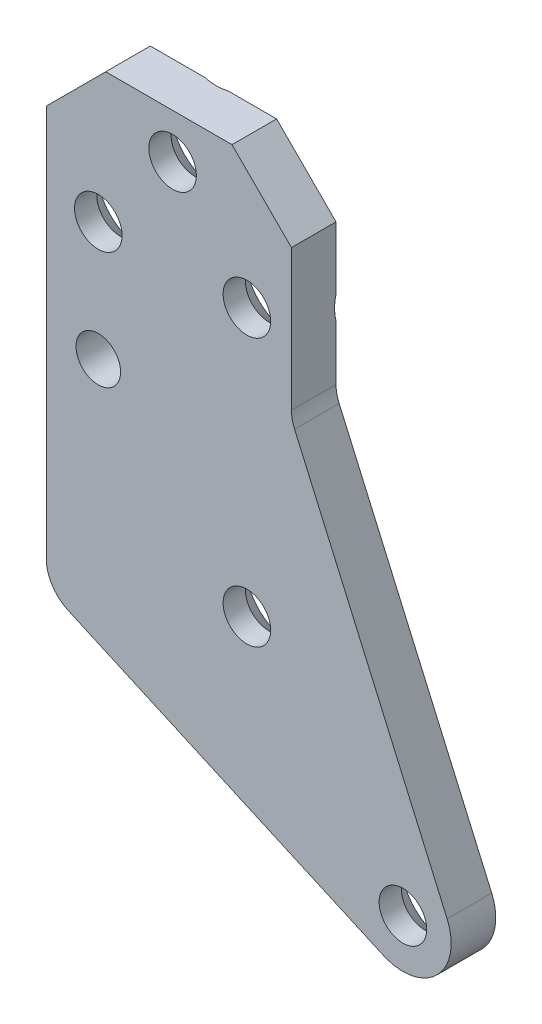
ISO-10303-21;
HEADER;
FILE_DESCRIPTION(('STEP AP214'),'2;1');
FILE_NAME('part.step','',(''),(''),'','','');
FILE_SCHEMA(('AUTOMOTIVE_DESIGN { 1 0 10303 214 1 1 1 1 }'));
ENDSEC;
DATA;
#1=APPLICATION_CONTEXT('core data for automotive mechanical design processes');
#2=APPLICATION_PROTOCOL_DEFINITION('international standard','automotive_design',2000,#1);
#3=PRODUCT_CONTEXT('',#1,'mechanical');
#4=PRODUCT('Part','Part','',(#3));
#5=PRODUCT_RELATED_PRODUCT_CATEGORY('part','',(#4));
#6=PRODUCT_DEFINITION_FORMATION('','',#4);
#7=PRODUCT_DEFINITION_CONTEXT('part definition',#1,'design');
#8=PRODUCT_DEFINITION('design','',#6,#7);
#9=PRODUCT_DEFINITION_SHAPE('','',#8);
#10=(LENGTH_UNIT() NAMED_UNIT(*) SI_UNIT(.MILLI.,.METRE.));
#11=(NAMED_UNIT(*) PLANE_ANGLE_UNIT() SI_UNIT($,.RADIAN.));
#12=(NAMED_UNIT(*) SI_UNIT($,.STERADIAN.) SOLID_ANGLE_UNIT());
#13=UNCERTAINTY_MEASURE_WITH_UNIT(LENGTH_MEASURE(1.E-05),#10,'distance_accuracy_value','');
#14=(GEOMETRIC_REPRESENTATION_CONTEXT(3) GLOBAL_UNCERTAINTY_ASSIGNED_CONTEXT((#13)) GLOBAL_UNIT_ASSIGNED_CONTEXT((#10,
#11,#12)) REPRESENTATION_CONTEXT('',''));
#15=CARTESIAN_POINT('',(0.,0.,0.));
#16=DIRECTION('',(0.,0.,1.));
#17=DIRECTION('',(1.,0.,0.));
#18=AXIS2_PLACEMENT_3D('',#15,#16,#17);
#19=CARTESIAN_POINT('',(20.5,-22.1865334794732,1.5));
#20=DIRECTION('',(0.,0.,1.));
#21=DIRECTION('',(1.,0.,0.));
#22=AXIS2_PLACEMENT_3D('',#19,#20,#21);
#23=PLANE('',#22);
#24=CARTESIAN_POINT('',(10.,8.,1.5));
#25=DIRECTION('',(0.,0.,1.));
#26=DIRECTION('',(1.,0.,0.));
#27=AXIS2_PLACEMENT_3D('',#24,#25,#26);
#28=CIRCLE('',#27,1.6);
#29=CARTESIAN_POINT('',(11.6,8.,1.5));
#30=VERTEX_POINT('',#29);
#31=EDGE_CURVE('E373',#30,#30,#28,.T.);
#32=ORIENTED_EDGE('',*,*,#31,.F.);
#33=EDGE_LOOP('',(#32));
#34=FACE_BOUND('',#33,.T.);
#35=CARTESIAN_POINT('',(20.5,-22.1865334794732,1.5));
#36=DIRECTION('',(0.,0.,1.));
#37=DIRECTION('',(1.,0.,0.));
#38=AXIS2_PLACEMENT_3D('',#35,#36,#37);
#39=CIRCLE('',#38,1.6);
#40=CARTESIAN_POINT('',(22.1,-22.1865334794732,1.5));
#41=VERTEX_POINT('',#40);
#42=EDGE_CURVE('E367',#41,#41,#39,.T.);
#43=ORIENTED_EDGE('',*,*,#42,.F.);
#44=EDGE_LOOP('',(#43));
#45=FACE_BOUND('',#44,.T.);
#46=CARTESIAN_POINT('',(0.,0.,1.5));
#47=DIRECTION('',(0.,0.,1.));
#48=DIRECTION('',(1.,0.,0.));
#49=AXIS2_PLACEMENT_3D('',#46,#47,#48);
#50=CIRCLE('',#49,1.5);
#51=CARTESIAN_POINT('',(1.5,0.,1.5));
#52=VERTEX_POINT('',#51);
#53=EDGE_CURVE('E361',#52,#52,#50,.T.);
#54=ORIENTED_EDGE('',*,*,#53,.F.);
#55=EDGE_LOOP('',(#54));
#56=FACE_BOUND('',#55,.T.);
#57=DIRECTION('',(0.,1.,0.));
#58=VECTOR('',#57,1.);
#59=CARTESIAN_POINT('',(13.,17.,1.5));
#60=LINE('',#59,#58);
#61=CARTESIAN_POINT('',(13.,3.52424415096324,1.5));
#62=VERTEX_POINT('',#61);
#63=CARTESIAN_POINT('',(13.,13.,1.5));
#64=VERTEX_POINT('',#63);
#65=EDGE_CURVE('E157',#62,#64,#60,.T.);
#66=ORIENTED_EDGE('',*,*,#65,.T.);
#67=DIRECTION('',(0.707106781186546,-0.707106781186549,0.));
#68=VECTOR('',#67,1.);
#69=CARTESIAN_POINT('',(34.3432667397366,-8.34326673973668,1.5));
#70=LINE('',#69,#68);
#71=CARTESIAN_POINT('',(9.,17.,1.5));
#72=VERTEX_POINT('',#71);
#73=EDGE_CURVE('E46',#64,#72,#70,.F.);
#74=ORIENTED_EDGE('',*,*,#73,.T.);
#75=DIRECTION('',(-1.,0.,0.));
#76=VECTOR('',#75,1.);
#77=CARTESIAN_POINT('',(-3.5,17.,1.5));
#78=LINE('',#77,#76);
#79=CARTESIAN_POINT('',(0.500000000000016,17.,1.5));
#80=VERTEX_POINT('',#79);
#81=EDGE_CURVE('E176',#72,#80,#78,.T.);
#82=ORIENTED_EDGE('',*,*,#81,.T.);
#83=DIRECTION('',(0.707106781186549,0.707106781186546,0.));
#84=VECTOR('',#83,1.);
#85=CARTESIAN_POINT('',(-9.09326673973655,7.40673326026348,1.5));
#86=LINE('',#85,#84);
#87=CARTESIAN_POINT('',(-3.5,13.,1.5));
#88=VERTEX_POINT('',#87);
#89=EDGE_CURVE('E53',#80,#88,#86,.F.);
#90=ORIENTED_EDGE('',*,*,#89,.T.);
#91=DIRECTION('',(0.,-1.,0.));
#92=VECTOR('',#91,1.);
#93=CARTESIAN_POINT('',(-3.5,17.,1.5));
#94=LINE('',#93,#92);
#95=CARTESIAN_POINT('',(-3.5,-13.3803085087297,1.5));
#96=VERTEX_POINT('',#95);
#97=EDGE_CURVE('E140',#88,#96,#94,.T.);
#98=ORIENTED_EDGE('',*,*,#97,.T.);
#99=CARTESIAN_POINT('',(-0.999999999999999,-13.3803085087297,1.5));
#100=DIRECTION('',(0.,0.,1.));
#101=DIRECTION('',(1.,0.,0.));
#102=AXIS2_PLACEMENT_3D('',#99,#100,#101);
#103=CIRCLE('',#102,2.5);
#104=CARTESIAN_POINT('',(-2.02176146059093,-15.6619753375308,1.5));
#105=VERTEX_POINT('',#104);
#106=EDGE_CURVE('E136',#96,#105,#103,.T.);
#107=ORIENTED_EDGE('',*,*,#106,.T.);
#108=DIRECTION('',(0.912666731520425,-0.408704584236371,0.));
#109=VECTOR('',#108,1.);
#110=CARTESIAN_POINT('',(-3.5,-15.,1.5));
#111=LINE('',#110,#109);
#112=CARTESIAN_POINT('',(19.1717101012318,-25.1527003569146,1.5));
#113=VERTEX_POINT('',#112);
#114=EDGE_CURVE('E128',#105,#113,#111,.T.);
#115=ORIENTED_EDGE('',*,*,#114,.T.);
#116=CARTESIAN_POINT('',(20.5,-22.1865334794732,1.5));
#117=DIRECTION('',(0.,0.,1.));
#118=DIRECTION('',(1.,0.,0.));
#119=AXIS2_PLACEMENT_3D('',#116,#117,#118);
#120=CIRCLE('',#119,3.25);
#121=CARTESIAN_POINT('',(23.4762140139334,-20.8809109676932,1.5));
#122=VERTEX_POINT('',#121);
#123=EDGE_CURVE('E133',#113,#122,#120,.T.);
#124=ORIENTED_EDGE('',*,*,#123,.T.);
#125=DIRECTION('',(-0.401730003624609,0.915758158133342,0.));
#126=VECTOR('',#125,1.);
#127=CARTESIAN_POINT('',(13.,3.,1.5));
#128=LINE('',#127,#126);
#129=CARTESIAN_POINT('',(13.2106046046666,2.51991914190172,1.5));
#130=VERTEX_POINT('',#129);
#131=EDGE_CURVE('E155',#122,#130,#128,.T.);
#132=ORIENTED_EDGE('',*,*,#131,.T.);
#133=CARTESIAN_POINT('',(15.5,3.52424415096324,1.5));
#134=DIRECTION('',(0.,0.,1.));
#135=DIRECTION('',(1.,0.,0.));
#136=AXIS2_PLACEMENT_3D('',#133,#134,#135);
#137=CIRCLE('',#136,2.5);
#138=EDGE_CURVE('E317',#130,#62,#137,.F.);
#139=ORIENTED_EDGE('',*,*,#138,.T.);
#140=EDGE_LOOP('',(#66,#74,#82,#90,#98,#107,#115,#124,#132,#139));
#141=FACE_BOUND('',#140,.T.);
#142=CARTESIAN_POINT('',(10.,-10.,1.5));
#143=DIRECTION('',(0.,0.,1.));
#144=DIRECTION('',(1.,0.,0.));
#145=AXIS2_PLACEMENT_3D('',#142,#143,#144);
#146=CIRCLE('',#145,1.6);
#147=CARTESIAN_POINT('',(11.6,-10.,1.5));
#148=VERTEX_POINT('',#147);
#149=EDGE_CURVE('E362',#148,#148,#146,.T.);
#150=ORIENTED_EDGE('',*,*,#149,.F.);
#151=EDGE_LOOP('',(#150));
#152=FACE_BOUND('',#151,.T.);
#153=CARTESIAN_POINT('',(0.,8.,1.5));
#154=DIRECTION('',(0.,0.,1.));
#155=DIRECTION('',(1.,0.,0.));
#156=AXIS2_PLACEMENT_3D('',#153,#154,#155);
#157=CIRCLE('',#156,1.6);
#158=CARTESIAN_POINT('',(1.6,8.,1.5));
#159=VERTEX_POINT('',#158);
#160=EDGE_CURVE('E370',#159,#159,#157,.T.);
#161=ORIENTED_EDGE('',*,*,#160,.F.);
#162=EDGE_LOOP('',(#161));
#163=FACE_BOUND('',#162,.T.);
#164=CARTESIAN_POINT('',(5.,14.,1.5));
#165=DIRECTION('',(0.,0.,1.));
#166=DIRECTION('',(1.,0.,0.));
#167=AXIS2_PLACEMENT_3D('',#164,#165,#166);
#168=CIRCLE('',#167,1.6);
#169=CARTESIAN_POINT('',(6.6,14.,1.5));
#170=VERTEX_POINT('',#169);
#171=EDGE_CURVE('E376',#170,#170,#168,.T.);
#172=ORIENTED_EDGE('',*,*,#171,.F.);
#173=EDGE_LOOP('',(#172));
#174=FACE_BOUND('',#173,.T.);
#175=ADVANCED_FACE('F37',(#34,#45,#56,#141,#152,#163,#174),#23,.T.);
#176=CARTESIAN_POINT('',(20.5,-22.1865334794732,-1.5));
#177=DIRECTION('',(0.,0.,1.));
#178=DIRECTION('',(1.,0.,0.));
#179=AXIS2_PLACEMENT_3D('',#176,#177,#178);
#180=PLANE('',#179);
#181=CARTESIAN_POINT('',(0.,8.,-1.5));
#182=DIRECTION('',(0.,0.,1.));
#183=DIRECTION('',(1.,0.,0.));
#184=AXIS2_PLACEMENT_3D('',#181,#182,#183);
#185=CIRCLE('',#184,3.09999999999999);
#186=CARTESIAN_POINT('',(3.09999999999999,8.,-1.5));
#187=VERTEX_POINT('',#186);
#188=EDGE_CURVE('E189',#187,#187,#185,.T.);
#189=ORIENTED_EDGE('',*,*,#188,.T.);
#190=EDGE_LOOP('',(#189));
#191=FACE_BOUND('',#190,.T.);
#192=CARTESIAN_POINT('',(10.,-10.,-1.5));
#193=DIRECTION('',(0.,0.,1.));
#194=DIRECTION('',(1.,0.,0.));
#195=AXIS2_PLACEMENT_3D('',#192,#193,#194);
#196=CIRCLE('',#195,3.09999999999999);
#197=CARTESIAN_POINT('',(13.1,-10.,-1.5));
#198=VERTEX_POINT('',#197);
#199=EDGE_CURVE('E180',#198,#198,#196,.T.);
#200=ORIENTED_EDGE('',*,*,#199,.T.);
#201=EDGE_LOOP('',(#200));
#202=FACE_BOUND('',#201,.T.);
#203=CARTESIAN_POINT('',(20.5,-22.1865334794732,-1.5));
#204=DIRECTION('',(0.,0.,1.));
#205=DIRECTION('',(1.,0.,0.));
#206=AXIS2_PLACEMENT_3D('',#203,#204,#205);
#207=CIRCLE('',#206,3.09999999999999);
#208=CARTESIAN_POINT('',(23.6,-22.1865334794732,-1.5));
#209=VERTEX_POINT('',#208);
#210=EDGE_CURVE('E149',#209,#209,#207,.T.);
#211=ORIENTED_EDGE('',*,*,#210,.T.);
#212=EDGE_LOOP('',(#211));
#213=FACE_BOUND('',#212,.T.);
#214=DIRECTION('',(-1.,0.,0.));
#215=VECTOR('',#214,1.);
#216=CARTESIAN_POINT('',(-3.5,17.,-1.5));
#217=LINE('',#216,#215);
#218=CARTESIAN_POINT('',(9.,17.,-1.5));
#219=VERTEX_POINT('',#218);
#220=CARTESIAN_POINT('',(5.78102496759063,17.,-1.5));
#221=VERTEX_POINT('',#220);
#222=EDGE_CURVE('E162',#219,#221,#217,.T.);
#223=ORIENTED_EDGE('',*,*,#222,.F.);
#224=DIRECTION('',(-0.707106781186546,0.707106781186549,0.));
#225=VECTOR('',#224,1.);
#226=CARTESIAN_POINT('',(9.,17.,-1.5));
#227=LINE('',#226,#225);
#228=CARTESIAN_POINT('',(13.,13.,-1.5));
#229=VERTEX_POINT('',#228);
#230=EDGE_CURVE('E310',#219,#229,#227,.F.);
#231=ORIENTED_EDGE('',*,*,#230,.T.);
#232=DIRECTION('',(0.,1.,0.));
#233=VECTOR('',#232,1.);
#234=CARTESIAN_POINT('',(13.,17.,-1.5));
#235=LINE('',#234,#233);
#236=CARTESIAN_POINT('',(13.,8.78102496759064,-1.5));
#237=VERTEX_POINT('',#236);
#238=EDGE_CURVE('E173',#237,#229,#235,.T.);
#239=ORIENTED_EDGE('',*,*,#238,.F.);
#240=CARTESIAN_POINT('',(10.,8.,-1.5));
#241=DIRECTION('',(0.,0.,1.));
#242=DIRECTION('',(1.,0.,0.));
#243=AXIS2_PLACEMENT_3D('',#240,#241,#242);
#244=CIRCLE('',#243,3.09999999999999);
#245=CARTESIAN_POINT('',(13.,7.21897503240936,-1.5));
#246=VERTEX_POINT('',#245);
#247=EDGE_CURVE('E183',#237,#246,#244,.T.);
#248=ORIENTED_EDGE('',*,*,#247,.T.);
#249=CARTESIAN_POINT('',(13.,3.52424415096324,-1.5));
#250=VERTEX_POINT('',#249);
#251=EDGE_CURVE('E174',#250,#246,#235,.T.);
#252=ORIENTED_EDGE('',*,*,#251,.F.);
#253=CARTESIAN_POINT('',(15.5,3.52424415096324,-1.5));
#254=DIRECTION('',(0.,0.,1.));
#255=DIRECTION('',(1.,0.,0.));
#256=AXIS2_PLACEMENT_3D('',#253,#254,#255);
#257=CIRCLE('',#256,2.5);
#258=CARTESIAN_POINT('',(13.2106046046666,2.51991914190172,-1.5));
#259=VERTEX_POINT('',#258);
#260=EDGE_CURVE('E319',#250,#259,#257,.T.);
#261=ORIENTED_EDGE('',*,*,#260,.T.);
#262=DIRECTION('',(-0.401730003624609,0.915758158133342,0.));
#263=VECTOR('',#262,1.);
#264=CARTESIAN_POINT('',(13.,3.,-1.5));
#265=LINE('',#264,#263);
#266=CARTESIAN_POINT('',(23.4762140139334,-20.8809109676932,-1.5));
#267=VERTEX_POINT('',#266);
#268=EDGE_CURVE('E170',#267,#259,#265,.T.);
#269=ORIENTED_EDGE('',*,*,#268,.F.);
#270=CARTESIAN_POINT('',(20.5,-22.1865334794732,-1.5));
#271=DIRECTION('',(0.,0.,1.));
#272=DIRECTION('',(1.,0.,0.));
#273=AXIS2_PLACEMENT_3D('',#270,#271,#272);
#274=CIRCLE('',#273,3.25);
#275=CARTESIAN_POINT('',(19.1717101012318,-25.1527003569146,-1.5));
#276=VERTEX_POINT('',#275);
#277=EDGE_CURVE('E168',#276,#267,#274,.T.);
#278=ORIENTED_EDGE('',*,*,#277,.F.);
#279=DIRECTION('',(0.912666731520425,-0.408704584236371,0.));
#280=VECTOR('',#279,1.);
#281=CARTESIAN_POINT('',(-3.5,-15.,-1.5));
#282=LINE('',#281,#280);
#283=CARTESIAN_POINT('',(-2.02176146059093,-15.6619753375308,-1.5));
#284=VERTEX_POINT('',#283);
#285=EDGE_CURVE('E146',#284,#276,#282,.T.);
#286=ORIENTED_EDGE('',*,*,#285,.F.);
#287=CARTESIAN_POINT('',(-0.999999999999999,-13.3803085087297,-1.5));
#288=DIRECTION('',(0.,0.,1.));
#289=DIRECTION('',(1.,0.,0.));
#290=AXIS2_PLACEMENT_3D('',#287,#288,#289);
#291=CIRCLE('',#290,2.5);
#292=CARTESIAN_POINT('',(-3.5,-13.3803085087297,-1.5));
#293=VERTEX_POINT('',#292);
#294=EDGE_CURVE('E325',#284,#293,#291,.F.);
#295=ORIENTED_EDGE('',*,*,#294,.T.);
#296=DIRECTION('',(0.,-1.,0.));
#297=VECTOR('',#296,1.);
#298=CARTESIAN_POINT('',(-3.5,17.,-1.5));
#299=LINE('',#298,#297);
#300=CARTESIAN_POINT('',(-3.5,13.,-1.5));
#301=VERTEX_POINT('',#300);
#302=EDGE_CURVE('E164',#301,#293,#299,.T.);
#303=ORIENTED_EDGE('',*,*,#302,.F.);
#304=DIRECTION('',(-0.707106781186549,-0.707106781186546,0.));
#305=VECTOR('',#304,1.);
#306=CARTESIAN_POINT('',(-3.5,13.,-1.5));
#307=LINE('',#306,#305);
#308=CARTESIAN_POINT('',(0.500000000000016,17.,-1.5));
#309=VERTEX_POINT('',#308);
#310=EDGE_CURVE('E312',#301,#309,#307,.F.);
#311=ORIENTED_EDGE('',*,*,#310,.T.);
#312=CARTESIAN_POINT('',(4.21897503240937,17.,-1.5));
#313=VERTEX_POINT('',#312);
#314=EDGE_CURVE('E165',#313,#309,#217,.T.);
#315=ORIENTED_EDGE('',*,*,#314,.F.);
#316=CARTESIAN_POINT('',(5.,14.,-1.5));
#317=DIRECTION('',(0.,0.,1.));
#318=DIRECTION('',(1.,0.,0.));
#319=AXIS2_PLACEMENT_3D('',#316,#317,#318);
#320=CIRCLE('',#319,3.09999999999999);
#321=EDGE_CURVE('E186',#313,#221,#320,.T.);
#322=ORIENTED_EDGE('',*,*,#321,.T.);
#323=EDGE_LOOP('',(#223,#231,#239,#248,#252,#261,#269,#278,#286,#295,#303,#311,#315,#322));
#324=FACE_BOUND('',#323,.T.);
#325=CARTESIAN_POINT('',(0.,0.,-1.5));
#326=DIRECTION('',(0.,0.,1.));
#327=DIRECTION('',(1.,0.,0.));
#328=AXIS2_PLACEMENT_3D('',#325,#326,#327);
#329=CIRCLE('',#328,1.5);
#330=CARTESIAN_POINT('',(1.5,0.,-1.5));
#331=VERTEX_POINT('',#330);
#332=EDGE_CURVE('E358',#331,#331,#329,.T.);
#333=ORIENTED_EDGE('',*,*,#332,.T.);
#334=EDGE_LOOP('',(#333));
#335=FACE_BOUND('',#334,.T.);
#336=ADVANCED_FACE('F215',(#191,#202,#213,#324,#335),#180,.F.);
#337=CARTESIAN_POINT('',(-3.5,17.,1.5));
#338=DIRECTION('',(0.,-1.,0.));
#339=DIRECTION('',(0.,0.,-1.));
#340=AXIS2_PLACEMENT_3D('',#337,#338,#339);
#341=PLANE('',#340);
#342=ORIENTED_EDGE('',*,*,#81,.F.);
#343=DIRECTION('',(0.,0.,-1.));
#344=VECTOR('',#343,1.);
#345=CARTESIAN_POINT('',(9.,17.,1.5));
#346=LINE('',#345,#344);
#347=EDGE_CURVE('E305',#72,#219,#346,.T.);
#348=ORIENTED_EDGE('',*,*,#347,.T.);
#349=ORIENTED_EDGE('',*,*,#222,.T.);
#350=CARTESIAN_POINT('',(5.78102496759063,17.,-1.5));
#351=CARTESIAN_POINT('',(5.70601645849245,17.,-1.48107565304789));
#352=CARTESIAN_POINT('',(5.63036250070065,17.,-1.46458929201314));
#353=CARTESIAN_POINT('',(5.47803968775437,17.,-1.43693145778756));
#354=CARTESIAN_POINT('',(5.40137016720541,17.,-1.42576366636801));
#355=CARTESIAN_POINT('',(5.24882098773028,17.,-1.40936241035835));
#356=CARTESIAN_POINT('',(5.17295295380512,17.,-1.40402299018798));
#357=CARTESIAN_POINT('',(5.02107271634564,17.,-1.39911335374772));
#358=CARTESIAN_POINT('',(4.94506059388722,17.,-1.39954051975779));
#359=CARTESIAN_POINT('',(4.76024835226651,17.,-1.40760330812));
#360=CARTESIAN_POINT('',(4.65156446200597,17.,-1.41829287879209));
#361=CARTESIAN_POINT('',(4.48912252560502,17.,-1.44270532594773));
#362=CARTESIAN_POINT('',(4.43470278752607,17.,-1.45233437143376));
#363=CARTESIAN_POINT('',(4.32641239287856,17.,-1.47423363961152));
#364=CARTESIAN_POINT('',(4.27254158145129,17.,-1.48650309452008));
#365=CARTESIAN_POINT('',(4.21897503240937,17.,-1.5));
#366=B_SPLINE_CURVE_WITH_KNOTS('',3,(#350,#351,#352,#353,#354,#355,#356,#357,#358,#359,#360,
#361,#362,#363,#364,#365),.UNSPECIFIED.,.F.,.F.,(4,2,2,2,2,2,2,4),(0.,0.23208016523222,
0.464320754897686,0.692265200278316,0.920106174619276,1.24702799001252,1.41276960047175,
1.57846308124115),.UNSPECIFIED.);
#367=EDGE_CURVE('E195',#221,#313,#366,.T.);
#368=ORIENTED_EDGE('',*,*,#367,.T.);
#369=ORIENTED_EDGE('',*,*,#314,.T.);
#370=DIRECTION('',(0.,0.,1.));
#371=VECTOR('',#370,1.);
#372=CARTESIAN_POINT('',(0.500000000000016,17.,1.5));
#373=LINE('',#372,#371);
#374=EDGE_CURVE('E315',#309,#80,#373,.T.);
#375=ORIENTED_EDGE('',*,*,#374,.T.);
#376=EDGE_LOOP('',(#342,#348,#349,#368,#369,#375));
#377=FACE_BOUND('',#376,.T.);
#378=ADVANCED_FACE('F210',(#377),#341,.F.);
#379=CARTESIAN_POINT('',(-3.5,17.,1.5));
#380=DIRECTION('',(1.,0.,0.));
#381=DIRECTION('',(0.,1.,0.));
#382=AXIS2_PLACEMENT_3D('',#379,#380,#381);
#383=PLANE('',#382);
#384=ORIENTED_EDGE('',*,*,#97,.F.);
#385=DIRECTION('',(0.,0.,-1.));
#386=VECTOR('',#385,1.);
#387=CARTESIAN_POINT('',(-3.5,13.,1.5));
#388=LINE('',#387,#386);
#389=EDGE_CURVE('E11',#88,#301,#388,.T.);
#390=ORIENTED_EDGE('',*,*,#389,.T.);
#391=ORIENTED_EDGE('',*,*,#302,.T.);
#392=DIRECTION('',(0.,0.,-1.));
#393=VECTOR('',#392,1.);
#394=CARTESIAN_POINT('',(-3.5,-13.3803085087297,1.5));
#395=LINE('',#394,#393);
#396=EDGE_CURVE('E322',#293,#96,#395,.F.);
#397=ORIENTED_EDGE('',*,*,#396,.T.);
#398=EDGE_LOOP('',(#384,#390,#391,#397));
#399=FACE_BOUND('',#398,.T.);
#400=ADVANCED_FACE('F214',(#399),#383,.F.);
#401=CARTESIAN_POINT('',(-3.5,-15.,1.5));
#402=DIRECTION('',(0.408704584236371,0.912666731520425,0.));
#403=DIRECTION('',(-0.912666731520425,0.408704584236371,0.));
#404=AXIS2_PLACEMENT_3D('',#401,#402,#403);
#405=PLANE('',#404);
#406=ORIENTED_EDGE('',*,*,#114,.F.);
#407=DIRECTION('',(0.,0.,-1.));
#408=VECTOR('',#407,1.);
#409=CARTESIAN_POINT('',(-2.02176146059092,-15.6619753375308,1.5));
#410=LINE('',#409,#408);
#411=EDGE_CURVE('E328',#105,#284,#410,.T.);
#412=ORIENTED_EDGE('',*,*,#411,.T.);
#413=ORIENTED_EDGE('',*,*,#285,.T.);
#414=DIRECTION('',(0.,0.,-1.));
#415=VECTOR('',#414,1.);
#416=CARTESIAN_POINT('',(19.1717101012318,-25.1527003569146,1.5));
#417=LINE('',#416,#415);
#418=EDGE_CURVE('E143',#113,#276,#417,.T.);
#419=ORIENTED_EDGE('',*,*,#418,.F.);
#420=EDGE_LOOP('',(#406,#412,#413,#419));
#421=FACE_BOUND('',#420,.T.);
#422=ADVANCED_FACE('F144',(#421),#405,.F.);
#423=CARTESIAN_POINT('',(20.5,-22.1865334794732,1.5));
#424=DIRECTION('',(0.,0.,-1.));
#425=DIRECTION('',(-1.,0.,0.));
#426=AXIS2_PLACEMENT_3D('',#423,#424,#425);
#427=CYLINDRICAL_SURFACE('',#426,3.25);
#428=ORIENTED_EDGE('',*,*,#277,.T.);
#429=DIRECTION('',(0.,0.,-1.));
#430=VECTOR('',#429,1.);
#431=CARTESIAN_POINT('',(23.4762140139334,-20.8809109676932,1.5));
#432=LINE('',#431,#430);
#433=EDGE_CURVE('E150',#122,#267,#432,.T.);
#434=ORIENTED_EDGE('',*,*,#433,.F.);
#435=ORIENTED_EDGE('',*,*,#123,.F.);
#436=ORIENTED_EDGE('',*,*,#418,.T.);
#437=EDGE_LOOP('',(#428,#434,#435,#436));
#438=FACE_BOUND('',#437,.T.);
#439=ADVANCED_FACE('F152',(#438),#427,.T.);
#440=CARTESIAN_POINT('',(13.,3.,1.5));
#441=DIRECTION('',(-0.915758158133342,-0.401730003624609,0.));
#442=DIRECTION('',(0.401730003624609,-0.915758158133342,0.));
#443=AXIS2_PLACEMENT_3D('',#440,#441,#442);
#444=PLANE('',#443);
#445=ORIENTED_EDGE('',*,*,#268,.T.);
#446=DIRECTION('',(0.,0.,-1.));
#447=VECTOR('',#446,1.);
#448=CARTESIAN_POINT('',(13.2106046046666,2.51991914190172,1.5));
#449=LINE('',#448,#447);
#450=EDGE_CURVE('E330',#259,#130,#449,.F.);
#451=ORIENTED_EDGE('',*,*,#450,.T.);
#452=ORIENTED_EDGE('',*,*,#131,.F.);
#453=ORIENTED_EDGE('',*,*,#433,.T.);
#454=EDGE_LOOP('',(#445,#451,#452,#453));
#455=FACE_BOUND('',#454,.T.);
#456=ADVANCED_FACE('F254',(#455),#444,.F.);
#457=CARTESIAN_POINT('',(13.,17.,1.5));
#458=DIRECTION('',(-1.,0.,0.));
#459=DIRECTION('',(0.,-1.,0.));
#460=AXIS2_PLACEMENT_3D('',#457,#458,#459);
#461=PLANE('',#460);
#462=ORIENTED_EDGE('',*,*,#238,.T.);
#463=DIRECTION('',(0.,0.,1.));
#464=VECTOR('',#463,1.);
#465=CARTESIAN_POINT('',(13.,13.,1.5));
#466=LINE('',#465,#464);
#467=EDGE_CURVE('E61',#229,#64,#466,.T.);
#468=ORIENTED_EDGE('',*,*,#467,.T.);
#469=ORIENTED_EDGE('',*,*,#65,.F.);
#470=DIRECTION('',(0.,0.,-1.));
#471=VECTOR('',#470,1.);
#472=CARTESIAN_POINT('',(13.,3.52424415096324,-1.5));
#473=LINE('',#472,#471);
#474=EDGE_CURVE('E332',#62,#250,#473,.T.);
#475=ORIENTED_EDGE('',*,*,#474,.T.);
#476=ORIENTED_EDGE('',*,*,#251,.T.);
#477=CARTESIAN_POINT('',(13.,7.21897503240936,-1.5));
#478=CARTESIAN_POINT('',(13.,7.29398354150754,-1.48107565304789));
#479=CARTESIAN_POINT('',(13.,7.36963749929934,-1.46458929201314));
#480=CARTESIAN_POINT('',(13.,7.52196031224562,-1.43693145778756));
#481=CARTESIAN_POINT('',(13.,7.59862983279458,-1.42576366636801));
#482=CARTESIAN_POINT('',(13.,7.75117901226971,-1.40936241035835));
#483=CARTESIAN_POINT('',(13.,7.82704704619487,-1.40402299018798));
#484=CARTESIAN_POINT('',(13.,7.97892728365435,-1.39911335374772));
#485=CARTESIAN_POINT('',(13.,8.05493940611277,-1.39954051975779));
#486=CARTESIAN_POINT('',(13.,8.23975164773348,-1.40760330811999));
#487=CARTESIAN_POINT('',(13.,8.34843553799402,-1.41829287879209));
#488=CARTESIAN_POINT('',(13.,8.51087747439498,-1.44270532594773));
#489=CARTESIAN_POINT('',(13.,8.56529721247393,-1.45233437143376));
#490=CARTESIAN_POINT('',(13.,8.67358760712144,-1.47423363961152));
#491=CARTESIAN_POINT('',(13.,8.72745841854871,-1.48650309452008));
#492=CARTESIAN_POINT('',(13.,8.78102496759064,-1.5));
#493=B_SPLINE_CURVE_WITH_KNOTS('',3,(#477,#478,#479,#480,#481,#482,#483,#484,#485,#486,#487,
#488,#489,#490,#491,#492),.UNSPECIFIED.,.F.,.F.,(4,2,2,2,2,2,2,4),(0.,0.23208016523222,
0.464320754897686,0.692265200278313,0.920106174619277,1.24702799001253,1.41276960047176,
1.57846308124117),.UNSPECIFIED.);
#494=EDGE_CURVE('E256',#246,#237,#493,.T.);
#495=ORIENTED_EDGE('',*,*,#494,.T.);
#496=EDGE_LOOP('',(#462,#468,#469,#475,#476,#495));
#497=FACE_BOUND('',#496,.T.);
#498=ADVANCED_FACE('F250',(#497),#461,.F.);
#499=CARTESIAN_POINT('',(0.,0.,1.5));
#500=DIRECTION('',(0.,0.,-1.));
#501=DIRECTION('',(-1.,0.,0.));
#502=AXIS2_PLACEMENT_3D('',#499,#500,#501);
#503=CYLINDRICAL_SURFACE('',#502,1.5);
#504=ORIENTED_EDGE('',*,*,#53,.T.);
#505=EDGE_LOOP('',(#504));
#506=FACE_BOUND('',#505,.T.);
#507=ORIENTED_EDGE('',*,*,#332,.F.);
#508=EDGE_LOOP('',(#507));
#509=FACE_BOUND('',#508,.T.);
#510=ADVANCED_FACE('F247',(#506,#509),#503,.F.);
#511=CARTESIAN_POINT('',(10.,-10.,1.5));
#512=DIRECTION('',(0.,0.,-1.));
#513=DIRECTION('',(-1.,0.,0.));
#514=AXIS2_PLACEMENT_3D('',#511,#512,#513);
#515=CYLINDRICAL_SURFACE('',#514,1.6);
#516=CARTESIAN_POINT('',(10.,-10.,0.));
#517=DIRECTION('',(0.,0.,1.));
#518=DIRECTION('',(1.,0.,0.));
#519=AXIS2_PLACEMENT_3D('',#516,#517,#518);
#520=CIRCLE('',#519,1.6);
#521=CARTESIAN_POINT('',(11.6,-10.,0.));
#522=VERTEX_POINT('',#521);
#523=EDGE_CURVE('E337',#522,#522,#520,.F.);
#524=ORIENTED_EDGE('',*,*,#523,.T.);
#525=EDGE_LOOP('',(#524));
#526=FACE_BOUND('',#525,.T.);
#527=ORIENTED_EDGE('',*,*,#149,.T.);
#528=EDGE_LOOP('',(#527));
#529=FACE_BOUND('',#528,.T.);
#530=ADVANCED_FACE('F392',(#526,#529),#515,.F.);
#531=CARTESIAN_POINT('',(20.5,-22.1865334794732,1.5));
#532=DIRECTION('',(0.,0.,-1.));
#533=DIRECTION('',(-1.,0.,0.));
#534=AXIS2_PLACEMENT_3D('',#531,#532,#533);
#535=CYLINDRICAL_SURFACE('',#534,1.6);
#536=CARTESIAN_POINT('',(20.5,-22.1865334794732,0.));
#537=DIRECTION('',(0.,0.,1.));
#538=DIRECTION('',(1.,0.,0.));
#539=AXIS2_PLACEMENT_3D('',#536,#537,#538);
#540=CIRCLE('',#539,1.6);
#541=CARTESIAN_POINT('',(22.1,-22.1865334794732,0.));
#542=VERTEX_POINT('',#541);
#543=EDGE_CURVE('E335',#542,#542,#540,.F.);
#544=ORIENTED_EDGE('',*,*,#543,.T.);
#545=EDGE_LOOP('',(#544));
#546=FACE_BOUND('',#545,.T.);
#547=ORIENTED_EDGE('',*,*,#42,.T.);
#548=EDGE_LOOP('',(#547));
#549=FACE_BOUND('',#548,.T.);
#550=ADVANCED_FACE('F387',(#546,#549),#535,.F.);
#551=CARTESIAN_POINT('',(0.,8.,1.5));
#552=DIRECTION('',(0.,0.,-1.));
#553=DIRECTION('',(-1.,0.,0.));
#554=AXIS2_PLACEMENT_3D('',#551,#552,#553);
#555=CYLINDRICAL_SURFACE('',#554,1.6);
#556=CARTESIAN_POINT('',(0.,8.,0.));
#557=DIRECTION('',(0.,0.,1.));
#558=DIRECTION('',(1.,0.,0.));
#559=AXIS2_PLACEMENT_3D('',#556,#557,#558);
#560=CIRCLE('',#559,1.6);
#561=CARTESIAN_POINT('',(1.6,8.,0.));
#562=VERTEX_POINT('',#561);
#563=EDGE_CURVE('E192',#562,#562,#560,.F.);
#564=ORIENTED_EDGE('',*,*,#563,.T.);
#565=EDGE_LOOP('',(#564));
#566=FACE_BOUND('',#565,.T.);
#567=ORIENTED_EDGE('',*,*,#160,.T.);
#568=EDGE_LOOP('',(#567));
#569=FACE_BOUND('',#568,.T.);
#570=ADVANCED_FACE('F382',(#566,#569),#555,.F.);
#571=CARTESIAN_POINT('',(10.,8.,1.5));
#572=DIRECTION('',(0.,0.,-1.));
#573=DIRECTION('',(-1.,0.,0.));
#574=AXIS2_PLACEMENT_3D('',#571,#572,#573);
#575=CYLINDRICAL_SURFACE('',#574,1.6);
#576=CARTESIAN_POINT('',(10.,8.,0.));
#577=DIRECTION('',(0.,0.,1.));
#578=DIRECTION('',(1.,0.,0.));
#579=AXIS2_PLACEMENT_3D('',#576,#577,#578);
#580=CIRCLE('',#579,1.6);
#581=CARTESIAN_POINT('',(11.6,8.,0.));
#582=VERTEX_POINT('',#581);
#583=EDGE_CURVE('E262',#582,#582,#580,.F.);
#584=ORIENTED_EDGE('',*,*,#583,.T.);
#585=EDGE_LOOP('',(#584));
#586=FACE_BOUND('',#585,.T.);
#587=ORIENTED_EDGE('',*,*,#31,.T.);
#588=EDGE_LOOP('',(#587));
#589=FACE_BOUND('',#588,.T.);
#590=ADVANCED_FACE('F231',(#586,#589),#575,.F.);
#591=CARTESIAN_POINT('',(5.,14.,1.5));
#592=DIRECTION('',(0.,0.,-1.));
#593=DIRECTION('',(-1.,0.,0.));
#594=AXIS2_PLACEMENT_3D('',#591,#592,#593);
#595=CYLINDRICAL_SURFACE('',#594,1.6);
#596=CARTESIAN_POINT('',(5.,14.,0.));
#597=DIRECTION('',(0.,0.,1.));
#598=DIRECTION('',(1.,0.,0.));
#599=AXIS2_PLACEMENT_3D('',#596,#597,#598);
#600=CIRCLE('',#599,1.6);
#601=CARTESIAN_POINT('',(6.6,14.,0.));
#602=VERTEX_POINT('',#601);
#603=EDGE_CURVE('E203',#602,#602,#600,.F.);
#604=ORIENTED_EDGE('',*,*,#603,.T.);
#605=EDGE_LOOP('',(#604));
#606=FACE_BOUND('',#605,.T.);
#607=ORIENTED_EDGE('',*,*,#171,.T.);
#608=EDGE_LOOP('',(#607));
#609=FACE_BOUND('',#608,.T.);
#610=ADVANCED_FACE('F223',(#606,#609),#595,.F.);
#611=CARTESIAN_POINT('',(0.,8.,-1.5));
#612=DIRECTION('',(0.,0.,-1.));
#613=DIRECTION('',(-1.,0.,0.));
#614=AXIS2_PLACEMENT_3D('',#611,#612,#613);
#615=CONICAL_SURFACE('',#614,3.09999999999999,0.785398163397446);
#616=ORIENTED_EDGE('',*,*,#563,.F.);
#617=EDGE_LOOP('',(#616));
#618=FACE_BOUND('',#617,.T.);
#619=ORIENTED_EDGE('',*,*,#188,.F.);
#620=EDGE_LOOP('',(#619));
#621=FACE_BOUND('',#620,.T.);
#622=ADVANCED_FACE('F219',(#618,#621),#615,.F.);
#623=CARTESIAN_POINT('',(5.,14.,-1.5));
#624=DIRECTION('',(0.,0.,-1.));
#625=DIRECTION('',(-1.,0.,0.));
#626=AXIS2_PLACEMENT_3D('',#623,#624,#625);
#627=CONICAL_SURFACE('',#626,3.09999999999999,0.785398163397446);
#628=ORIENTED_EDGE('',*,*,#603,.F.);
#629=EDGE_LOOP('',(#628));
#630=FACE_BOUND('',#629,.T.);
#631=ORIENTED_EDGE('',*,*,#367,.F.);
#632=ORIENTED_EDGE('',*,*,#321,.F.);
#633=EDGE_LOOP('',(#631,#632));
#634=FACE_BOUND('',#633,.T.);
#635=ADVANCED_FACE('F206',(#630,#634),#627,.F.);
#636=CARTESIAN_POINT('',(10.,8.,-1.5));
#637=DIRECTION('',(0.,0.,-1.));
#638=DIRECTION('',(-1.,0.,0.));
#639=AXIS2_PLACEMENT_3D('',#636,#637,#638);
#640=CONICAL_SURFACE('',#639,3.09999999999999,0.785398163397446);
#641=ORIENTED_EDGE('',*,*,#583,.F.);
#642=EDGE_LOOP('',(#641));
#643=FACE_BOUND('',#642,.T.);
#644=ORIENTED_EDGE('',*,*,#494,.F.);
#645=ORIENTED_EDGE('',*,*,#247,.F.);
#646=EDGE_LOOP('',(#644,#645));
#647=FACE_BOUND('',#646,.T.);
#648=ADVANCED_FACE('F229',(#643,#647),#640,.F.);
#649=CARTESIAN_POINT('',(10.,-10.,-1.5));
#650=DIRECTION('',(0.,0.,-1.));
#651=DIRECTION('',(-1.,0.,0.));
#652=AXIS2_PLACEMENT_3D('',#649,#650,#651);
#653=CONICAL_SURFACE('',#652,3.09999999999999,0.785398163397446);
#654=ORIENTED_EDGE('',*,*,#523,.F.);
#655=EDGE_LOOP('',(#654));
#656=FACE_BOUND('',#655,.T.);
#657=ORIENTED_EDGE('',*,*,#199,.F.);
#658=EDGE_LOOP('',(#657));
#659=FACE_BOUND('',#658,.T.);
#660=ADVANCED_FACE('F271',(#656,#659),#653,.F.);
#661=CARTESIAN_POINT('',(20.5,-22.1865334794732,-1.5));
#662=DIRECTION('',(0.,0.,-1.));
#663=DIRECTION('',(-1.,0.,0.));
#664=AXIS2_PLACEMENT_3D('',#661,#662,#663);
#665=CONICAL_SURFACE('',#664,3.09999999999999,0.785398163397444);
#666=ORIENTED_EDGE('',*,*,#543,.F.);
#667=EDGE_LOOP('',(#666));
#668=FACE_BOUND('',#667,.T.);
#669=ORIENTED_EDGE('',*,*,#210,.F.);
#670=EDGE_LOOP('',(#669));
#671=FACE_BOUND('',#670,.T.);
#672=ADVANCED_FACE('F278',(#668,#671),#665,.F.);
#673=CARTESIAN_POINT('',(15.5,3.52424415096324,1.5));
#674=DIRECTION('',(0.,0.,1.));
#675=DIRECTION('',(1.,0.,0.));
#676=AXIS2_PLACEMENT_3D('',#673,#674,#675);
#677=CYLINDRICAL_SURFACE('',#676,2.5);
#678=ORIENTED_EDGE('',*,*,#138,.F.);
#679=ORIENTED_EDGE('',*,*,#450,.F.);
#680=ORIENTED_EDGE('',*,*,#260,.F.);
#681=ORIENTED_EDGE('',*,*,#474,.F.);
#682=EDGE_LOOP('',(#678,#679,#680,#681));
#683=FACE_BOUND('',#682,.T.);
#684=ADVANCED_FACE('F285',(#683),#677,.F.);
#685=CARTESIAN_POINT('',(-0.999999999999999,-13.3803085087297,1.5));
#686=DIRECTION('',(0.,0.,-1.));
#687=DIRECTION('',(-1.,0.,0.));
#688=AXIS2_PLACEMENT_3D('',#685,#686,#687);
#689=CYLINDRICAL_SURFACE('',#688,2.5);
#690=ORIENTED_EDGE('',*,*,#106,.F.);
#691=ORIENTED_EDGE('',*,*,#396,.F.);
#692=ORIENTED_EDGE('',*,*,#294,.F.);
#693=ORIENTED_EDGE('',*,*,#411,.F.);
#694=EDGE_LOOP('',(#690,#691,#692,#693));
#695=FACE_BOUND('',#694,.T.);
#696=ADVANCED_FACE('F289',(#695),#689,.T.);
#697=CARTESIAN_POINT('',(9.,17.,1.5));
#698=DIRECTION('',(-0.707106781186549,-0.707106781186546,0.));
#699=DIRECTION('',(0.,0.,-1.));
#700=AXIS2_PLACEMENT_3D('',#697,#698,#699);
#701=PLANE('',#700);
#702=ORIENTED_EDGE('',*,*,#73,.F.);
#703=ORIENTED_EDGE('',*,*,#467,.F.);
#704=ORIENTED_EDGE('',*,*,#230,.F.);
#705=ORIENTED_EDGE('',*,*,#347,.F.);
#706=EDGE_LOOP('',(#702,#703,#704,#705));
#707=FACE_BOUND('',#706,.T.);
#708=ADVANCED_FACE('F292',(#707),#701,.F.);
#709=CARTESIAN_POINT('',(-3.5,13.,1.5));
#710=DIRECTION('',(0.707106781186546,-0.707106781186549,0.));
#711=DIRECTION('',(0.,0.,-1.));
#712=AXIS2_PLACEMENT_3D('',#709,#710,#711);
#713=PLANE('',#712);
#714=ORIENTED_EDGE('',*,*,#89,.F.);
#715=ORIENTED_EDGE('',*,*,#374,.F.);
#716=ORIENTED_EDGE('',*,*,#310,.F.);
#717=ORIENTED_EDGE('',*,*,#389,.F.);
#718=EDGE_LOOP('',(#714,#715,#716,#717));
#719=FACE_BOUND('',#718,.T.);
#720=ADVANCED_FACE('F40',(#719),#713,.F.);
#721=CLOSED_SHELL('',(#175,#336,#378,#400,#422,#439,#456,#498,#510,#530,#550,#570,#590,#610,
#622,#635,#648,#660,#672,#684,#696,#708,#720));
#722=MANIFOLD_SOLID_BREP('B2',#721);
#723=ADVANCED_BREP_SHAPE_REPRESENTATION('',(#18,#722),#14);
#724=SHAPE_DEFINITION_REPRESENTATION(#9,#723);
ENDSEC;
END-ISO-10303-21;
